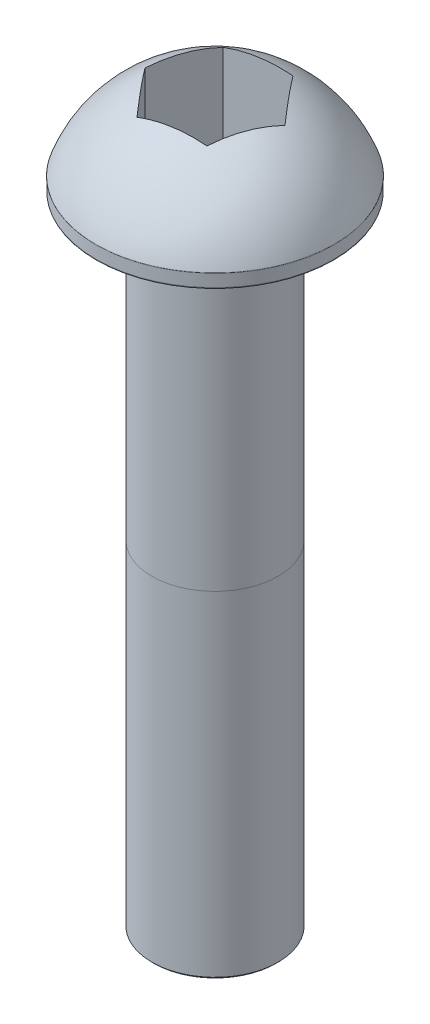
ISO-10303-21;
HEADER;
FILE_DESCRIPTION(('STEP AP214'),'2;1');
FILE_NAME('part.step','',(''),(''),'','','');
FILE_SCHEMA(('AUTOMOTIVE_DESIGN { 1 0 10303 214 1 1 1 1 }'));
ENDSEC;
DATA;
#1=APPLICATION_CONTEXT('core data for automotive mechanical design processes');
#2=APPLICATION_PROTOCOL_DEFINITION('international standard','automotive_design',2000,#1);
#3=PRODUCT_CONTEXT('',#1,'mechanical');
#4=PRODUCT('Part','Part','',(#3));
#5=PRODUCT_RELATED_PRODUCT_CATEGORY('part','',(#4));
#6=PRODUCT_DEFINITION_FORMATION('','',#4);
#7=PRODUCT_DEFINITION_CONTEXT('part definition',#1,'design');
#8=PRODUCT_DEFINITION('design','',#6,#7);
#9=PRODUCT_DEFINITION_SHAPE('','',#8);
#10=(LENGTH_UNIT() NAMED_UNIT(*) SI_UNIT(.MILLI.,.METRE.));
#11=(NAMED_UNIT(*) PLANE_ANGLE_UNIT() SI_UNIT($,.RADIAN.));
#12=(NAMED_UNIT(*) SI_UNIT($,.STERADIAN.) SOLID_ANGLE_UNIT());
#13=UNCERTAINTY_MEASURE_WITH_UNIT(LENGTH_MEASURE(1.E-05),#10,'distance_accuracy_value','');
#14=(GEOMETRIC_REPRESENTATION_CONTEXT(3) GLOBAL_UNCERTAINTY_ASSIGNED_CONTEXT((#13)) GLOBAL_UNIT_ASSIGNED_CONTEXT((#10,
#11,#12)) REPRESENTATION_CONTEXT('',''));
#15=CARTESIAN_POINT('',(0.,0.,0.));
#16=DIRECTION('',(0.,0.,1.));
#17=DIRECTION('',(1.,0.,0.));
#18=AXIS2_PLACEMENT_3D('',#15,#16,#17);
#19=CARTESIAN_POINT('',(0.,22.75,0.));
#20=DIRECTION('',(0.,-1.,0.));
#21=DIRECTION('',(0.,0.,-1.));
#22=AXIS2_PLACEMENT_3D('',#19,#20,#21);
#23=CYLINDRICAL_SURFACE('',#22,2.25);
#24=CARTESIAN_POINT('',(0.,0.0750000000000021,0.));
#25=DIRECTION('',(0.,1.,0.));
#26=DIRECTION('',(0.,0.,1.));
#27=AXIS2_PLACEMENT_3D('',#24,#25,#26);
#28=CIRCLE('',#27,2.25);
#29=CARTESIAN_POINT('',(0.,0.0750000000000021,2.25));
#30=VERTEX_POINT('',#29);
#31=EDGE_CURVE('E151',#30,#30,#28,.T.);
#32=ORIENTED_EDGE('',*,*,#31,.T.);
#33=EDGE_LOOP('',(#32));
#34=FACE_BOUND('',#33,.T.);
#35=CARTESIAN_POINT('',(0.,12.,0.));
#36=DIRECTION('',(0.,1.,0.));
#37=DIRECTION('',(0.,0.,1.));
#38=AXIS2_PLACEMENT_3D('',#35,#36,#37);
#39=CIRCLE('',#38,2.25);
#40=CARTESIAN_POINT('',(0.,12.,2.25));
#41=VERTEX_POINT('',#40);
#42=EDGE_CURVE('E11',#41,#41,#39,.T.);
#43=ORIENTED_EDGE('',*,*,#42,.F.);
#44=EDGE_LOOP('',(#43));
#45=FACE_BOUND('',#44,.T.);
#46=ADVANCED_FACE('F39',(#34,#45),#23,.T.);
#47=CARTESIAN_POINT('',(1.38021317383571,26.251,1.66808620723581));
#48=DIRECTION('',(0.166857261222646,0.,0.985981061875571));
#49=DIRECTION('',(0.985981061875571,0.,-0.166857261222646));
#50=AXIS2_PLACEMENT_3D('',#47,#48,#49);
#51=PLANE('',#50);
#52=DIRECTION('',(-0.985981061875571,0.,0.166857261222646));
#53=VECTOR('',#52,1.);
#54=CARTESIAN_POINT('',(1.38021317383571,17.,1.66808620723581));
#55=LINE('',#54,#53);
#56=CARTESIAN_POINT('',(1.38021317383571,17.,1.66808620723581));
#57=VERTEX_POINT('',#56);
#58=CARTESIAN_POINT('',(-0.75449844425079,17.,2.02934277479758));
#59=VERTEX_POINT('',#58);
#60=EDGE_CURVE('E55',#57,#59,#55,.T.);
#61=ORIENTED_EDGE('',*,*,#60,.T.);
#62=DIRECTION('',(0.,-1.,0.));
#63=VECTOR('',#62,1.);
#64=CARTESIAN_POINT('',(-0.75449844425079,26.251,2.02934277479758));
#65=LINE('',#64,#63);
#66=CARTESIAN_POINT('',(-0.75449844425079,25.6963949926045,2.02934277479758));
#67=VERTEX_POINT('',#66);
#68=EDGE_CURVE('E124',#67,#59,#65,.T.);
#69=ORIENTED_EDGE('',*,*,#68,.F.);
#70=CARTESIAN_POINT('',(0.31285736479246,21.7395833333333,1.84871449101669));
#71=DIRECTION('',(0.166857261222646,0.,0.985981061875571));
#72=DIRECTION('',(0.985981061875571,0.,-0.166857261222646));
#73=AXIS2_PLACEMENT_3D('',#70,#71,#72);
#74=CIRCLE('',#73,4.10222299576028);
#75=CARTESIAN_POINT('',(1.38021317383571,25.6963949926045,1.66808620723581));
#76=VERTEX_POINT('',#75);
#77=EDGE_CURVE('E118',#76,#67,#74,.T.);
#78=ORIENTED_EDGE('',*,*,#77,.F.);
#79=DIRECTION('',(0.,-1.,0.));
#80=VECTOR('',#79,1.);
#81=CARTESIAN_POINT('',(1.38021317383571,26.251,1.66808620723581));
#82=LINE('',#81,#80);
#83=EDGE_CURVE('E126',#76,#57,#82,.T.);
#84=ORIENTED_EDGE('',*,*,#83,.T.);
#85=EDGE_LOOP('',(#61,#69,#78,#84));
#86=FACE_BOUND('',#85,.T.);
#87=ADVANCED_FACE('F194',(#86),#51,.F.);
#88=CARTESIAN_POINT('',(-0.75449844425079,26.251,2.02934277479758));
#89=DIRECTION('',(-0.770456016623278,0.,0.637493157962492));
#90=DIRECTION('',(0.637493157962492,0.,0.770456016623278));
#91=AXIS2_PLACEMENT_3D('',#88,#89,#90);
#92=PLANE('',#91);
#93=DIRECTION('',(-0.637493157962492,0.,-0.770456016623278));
#94=VECTOR('',#93,1.);
#95=CARTESIAN_POINT('',(-0.75449844425079,17.,2.02934277479758));
#96=LINE('',#95,#94);
#97=CARTESIAN_POINT('',(-2.1347116180865,17.,0.361256567561766));
#98=VERTEX_POINT('',#97);
#99=EDGE_CURVE('E62',#59,#98,#96,.T.);
#100=ORIENTED_EDGE('',*,*,#99,.T.);
#101=DIRECTION('',(0.,-1.,0.));
#102=VECTOR('',#101,1.);
#103=CARTESIAN_POINT('',(-2.1347116180865,26.251,0.361256567561766));
#104=LINE('',#103,#102);
#105=CARTESIAN_POINT('',(-2.1347116180865,25.6963949926045,0.361256567561766));
#106=VERTEX_POINT('',#105);
#107=EDGE_CURVE('E135',#106,#98,#104,.T.);
#108=ORIENTED_EDGE('',*,*,#107,.F.);
#109=CARTESIAN_POINT('',(-1.44460503116865,21.7395833333333,1.19529967117967));
#110=DIRECTION('',(-0.770456016623278,0.,0.637493157962492));
#111=DIRECTION('',(0.637493157962492,0.,0.770456016623278));
#112=AXIS2_PLACEMENT_3D('',#109,#110,#111);
#113=CIRCLE('',#112,4.10222299576028);
#114=EDGE_CURVE('E136',#67,#106,#113,.T.);
#115=ORIENTED_EDGE('',*,*,#114,.F.);
#116=ORIENTED_EDGE('',*,*,#68,.T.);
#117=EDGE_LOOP('',(#100,#108,#115,#116));
#118=FACE_BOUND('',#117,.T.);
#119=ADVANCED_FACE('F200',(#118),#92,.F.);
#120=CARTESIAN_POINT('',(-2.1347116180865,26.251,0.361256567561766));
#121=DIRECTION('',(-0.937313277845923,0.,-0.348487903913078));
#122=DIRECTION('',(-0.348487903913078,0.,0.937313277845923));
#123=AXIS2_PLACEMENT_3D('',#120,#121,#122);
#124=PLANE('',#123);
#125=DIRECTION('',(0.348487903913078,0.,-0.937313277845923));
#126=VECTOR('',#125,1.);
#127=CARTESIAN_POINT('',(-2.1347116180865,17.,0.361256567561766));
#128=LINE('',#127,#126);
#129=CARTESIAN_POINT('',(-1.38021317383571,17.,-1.66808620723581));
#130=VERTEX_POINT('',#129);
#131=EDGE_CURVE('E354',#98,#130,#128,.T.);
#132=ORIENTED_EDGE('',*,*,#131,.T.);
#133=DIRECTION('',(0.,-1.,0.));
#134=VECTOR('',#133,1.);
#135=CARTESIAN_POINT('',(-1.38021317383571,26.251,-1.66808620723581));
#136=LINE('',#135,#134);
#137=CARTESIAN_POINT('',(-1.38021317383571,25.6963949926045,-1.66808620723581));
#138=VERTEX_POINT('',#137);
#139=EDGE_CURVE('E131',#138,#130,#136,.T.);
#140=ORIENTED_EDGE('',*,*,#139,.F.);
#141=CARTESIAN_POINT('',(-1.75746239596111,21.7395833333333,-0.653414819837022));
#142=DIRECTION('',(-0.937313277845923,0.,-0.348487903913078));
#143=DIRECTION('',(-0.348487903913078,0.,0.937313277845923));
#144=AXIS2_PLACEMENT_3D('',#141,#142,#143);
#145=CIRCLE('',#144,4.10222299576028);
#146=EDGE_CURVE('E132',#106,#138,#145,.T.);
#147=ORIENTED_EDGE('',*,*,#146,.F.);
#148=ORIENTED_EDGE('',*,*,#107,.T.);
#149=EDGE_LOOP('',(#132,#140,#147,#148));
#150=FACE_BOUND('',#149,.T.);
#151=ADVANCED_FACE('F228',(#150),#124,.F.);
#152=CARTESIAN_POINT('',(-1.38021317383571,26.251,-1.66808620723581));
#153=DIRECTION('',(-0.166857261222645,0.,-0.985981061875571));
#154=DIRECTION('',(-0.985981061875571,0.,0.166857261222645));
#155=AXIS2_PLACEMENT_3D('',#152,#153,#154);
#156=PLANE('',#155);
#157=DIRECTION('',(0.985981061875571,0.,-0.166857261222645));
#158=VECTOR('',#157,1.);
#159=CARTESIAN_POINT('',(-1.38021317383571,17.,-1.66808620723581));
#160=LINE('',#159,#158);
#161=CARTESIAN_POINT('',(0.754498444250791,17.,-2.02934277479758));
#162=VERTEX_POINT('',#161);
#163=EDGE_CURVE('E114',#130,#162,#160,.T.);
#164=ORIENTED_EDGE('',*,*,#163,.T.);
#165=DIRECTION('',(0.,-1.,0.));
#166=VECTOR('',#165,1.);
#167=CARTESIAN_POINT('',(0.754498444250791,26.251,-2.02934277479758));
#168=LINE('',#167,#166);
#169=CARTESIAN_POINT('',(0.754498444250791,25.6963949926045,-2.02934277479758));
#170=VERTEX_POINT('',#169);
#171=EDGE_CURVE('E111',#170,#162,#168,.T.);
#172=ORIENTED_EDGE('',*,*,#171,.F.);
#173=CARTESIAN_POINT('',(-0.31285736479246,21.7395833333333,-1.8487144910167));
#174=DIRECTION('',(-0.166857261222645,0.,-0.985981061875571));
#175=DIRECTION('',(-0.985981061875571,0.,0.166857261222645));
#176=AXIS2_PLACEMENT_3D('',#173,#174,#175);
#177=CIRCLE('',#176,4.10222299576028);
#178=EDGE_CURVE('E128',#138,#170,#177,.T.);
#179=ORIENTED_EDGE('',*,*,#178,.F.);
#180=ORIENTED_EDGE('',*,*,#139,.T.);
#181=EDGE_LOOP('',(#164,#172,#179,#180));
#182=FACE_BOUND('',#181,.T.);
#183=ADVANCED_FACE('F231',(#182),#156,.F.);
#184=CARTESIAN_POINT('',(0.754498444250791,26.251,-2.02934277479758));
#185=DIRECTION('',(0.770456016623278,0.,-0.637493157962492));
#186=DIRECTION('',(-0.637493157962492,0.,-0.770456016623278));
#187=AXIS2_PLACEMENT_3D('',#184,#185,#186);
#188=PLANE('',#187);
#189=DIRECTION('',(0.637493157962492,0.,0.770456016623278));
#190=VECTOR('',#189,1.);
#191=CARTESIAN_POINT('',(0.754498444250791,17.,-2.02934277479758));
#192=LINE('',#191,#190);
#193=CARTESIAN_POINT('',(2.1347116180865,17.,-0.361256567561767));
#194=VERTEX_POINT('',#193);
#195=EDGE_CURVE('E108',#162,#194,#192,.T.);
#196=ORIENTED_EDGE('',*,*,#195,.T.);
#197=DIRECTION('',(0.,-1.,0.));
#198=VECTOR('',#197,1.);
#199=CARTESIAN_POINT('',(2.1347116180865,26.251,-0.361256567561767));
#200=LINE('',#199,#198);
#201=CARTESIAN_POINT('',(2.1347116180865,25.6963949926045,-0.361256567561767));
#202=VERTEX_POINT('',#201);
#203=EDGE_CURVE('E95',#202,#194,#200,.T.);
#204=ORIENTED_EDGE('',*,*,#203,.F.);
#205=CARTESIAN_POINT('',(1.44460503116865,21.7395833333333,-1.19529967117967));
#206=DIRECTION('',(0.770456016623278,0.,-0.637493157962492));
#207=DIRECTION('',(-0.637493157962492,0.,-0.770456016623278));
#208=AXIS2_PLACEMENT_3D('',#205,#206,#207);
#209=CIRCLE('',#208,4.10222299576028);
#210=EDGE_CURVE('E104',#170,#202,#209,.T.);
#211=ORIENTED_EDGE('',*,*,#210,.F.);
#212=ORIENTED_EDGE('',*,*,#171,.T.);
#213=EDGE_LOOP('',(#196,#204,#211,#212));
#214=FACE_BOUND('',#213,.T.);
#215=ADVANCED_FACE('F109',(#214),#188,.F.);
#216=CARTESIAN_POINT('',(2.1347116180865,26.251,-0.361256567561767));
#217=DIRECTION('',(0.937313277845923,0.,0.348487903913078));
#218=DIRECTION('',(0.348487903913078,0.,-0.937313277845923));
#219=AXIS2_PLACEMENT_3D('',#216,#217,#218);
#220=PLANE('',#219);
#221=DIRECTION('',(-0.348487903913078,0.,0.937313277845923));
#222=VECTOR('',#221,1.);
#223=CARTESIAN_POINT('',(2.1347116180865,17.,-0.361256567561767));
#224=LINE('',#223,#222);
#225=EDGE_CURVE('E99',#194,#57,#224,.T.);
#226=ORIENTED_EDGE('',*,*,#225,.T.);
#227=ORIENTED_EDGE('',*,*,#83,.F.);
#228=CARTESIAN_POINT('',(1.75746239596111,21.7395833333333,0.653414819837022));
#229=DIRECTION('',(0.937313277845923,0.,0.348487903913078));
#230=DIRECTION('',(0.348487903913078,0.,-0.937313277845923));
#231=AXIS2_PLACEMENT_3D('',#228,#229,#230);
#232=CIRCLE('',#231,4.10222299576028);
#233=EDGE_CURVE('E101',#202,#76,#232,.T.);
#234=ORIENTED_EDGE('',*,*,#233,.F.);
#235=ORIENTED_EDGE('',*,*,#203,.T.);
#236=EDGE_LOOP('',(#226,#227,#234,#235));
#237=FACE_BOUND('',#236,.T.);
#238=ADVANCED_FACE('F97',(#237),#220,.F.);
#239=ORIENTED_EDGE('',*,*,#42,.T.);
#240=EDGE_LOOP('',(#239));
#241=FACE_BOUND('',#240,.T.);
#242=CARTESIAN_POINT('',(0.,22.25,0.));
#243=DIRECTION('',(0.,1.,0.));
#244=DIRECTION('',(0.,0.,1.));
#245=AXIS2_PLACEMENT_3D('',#242,#243,#244);
#246=CIRCLE('',#245,2.25);
#247=CARTESIAN_POINT('',(0.,22.25,2.25));
#248=VERTEX_POINT('',#247);
#249=EDGE_CURVE('E148',#248,#248,#246,.F.);
#250=ORIENTED_EDGE('',*,*,#249,.T.);
#251=EDGE_LOOP('',(#250));
#252=FACE_BOUND('',#251,.T.);
#253=ADVANCED_FACE('F189',(#241,#252),#23,.T.);
#254=CARTESIAN_POINT('',(0.,0.,0.));
#255=DIRECTION('',(0.,1.,0.));
#256=DIRECTION('',(0.,0.,1.));
#257=AXIS2_PLACEMENT_3D('',#254,#255,#256);
#258=PLANE('',#257);
#259=CARTESIAN_POINT('',(0.,0.,0.));
#260=DIRECTION('',(0.,1.,0.));
#261=DIRECTION('',(0.,0.,1.));
#262=AXIS2_PLACEMENT_3D('',#259,#260,#261);
#263=CIRCLE('',#262,2.175);
#264=CARTESIAN_POINT('',(0.,0.,2.175));
#265=VERTEX_POINT('',#264);
#266=EDGE_CURVE('E154',#265,#265,#263,.F.);
#267=ORIENTED_EDGE('',*,*,#266,.T.);
#268=EDGE_LOOP('',(#267));
#269=FACE_BOUND('',#268,.T.);
#270=ADVANCED_FACE('F179',(#269),#258,.F.);
#271=CARTESIAN_POINT('',(0.,23.25,0.));
#272=DIRECTION('',(0.,-1.,0.));
#273=DIRECTION('',(0.,0.,-1.));
#274=AXIS2_PLACEMENT_3D('',#271,#272,#273);
#275=CYLINDRICAL_SURFACE('',#274,4.25);
#276=CARTESIAN_POINT('',(0.,23.2413545676689,0.));
#277=DIRECTION('',(0.,-0.999999999999999,0.));
#278=DIRECTION('',(0.,0.,-1.));
#279=AXIS2_PLACEMENT_3D('',#276,#277,#278);
#280=CIRCLE('',#279,4.25);
#281=CARTESIAN_POINT('',(0.,23.2413545676689,-4.25));
#282=VERTEX_POINT('',#281);
#283=EDGE_CURVE('E163',#282,#282,#280,.T.);
#284=ORIENTED_EDGE('',*,*,#283,.T.);
#285=EDGE_LOOP('',(#284));
#286=FACE_BOUND('',#285,.T.);
#287=CARTESIAN_POINT('',(0.,22.8,0.));
#288=DIRECTION('',(0.,1.,0.));
#289=DIRECTION('',(0.,0.,1.));
#290=AXIS2_PLACEMENT_3D('',#287,#288,#289);
#291=CIRCLE('',#290,4.25);
#292=CARTESIAN_POINT('',(0.,22.8,4.25));
#293=VERTEX_POINT('',#292);
#294=EDGE_CURVE('E160',#293,#293,#291,.T.);
#295=ORIENTED_EDGE('',*,*,#294,.T.);
#296=EDGE_LOOP('',(#295));
#297=FACE_BOUND('',#296,.T.);
#298=ADVANCED_FACE('F176',(#286,#297),#275,.T.);
#299=CARTESIAN_POINT('',(0.,21.7395833333333,0.));
#300=DIRECTION('',(0.,0.,1.));
#301=DIRECTION('',(1.,0.,0.));
#302=AXIS2_PLACEMENT_3D('',#299,#300,#301);
#303=SPHERICAL_SURFACE('',#302,4.51041666666667);
#304=CARTESIAN_POINT('',(0.,23.2581889953308,0.));
#305=DIRECTION('',(0.,-0.999999999999999,0.));
#306=DIRECTION('',(0.,0.,-1.));
#307=AXIS2_PLACEMENT_3D('',#304,#305,#306);
#308=CIRCLE('',#307,4.24708080336291);
#309=CARTESIAN_POINT('',(0.,23.2581889953308,-4.24708080336291));
#310=VERTEX_POINT('',#309);
#311=EDGE_CURVE('E157',#310,#310,#308,.F.);
#312=ORIENTED_EDGE('',*,*,#311,.T.);
#313=EDGE_LOOP('',(#312));
#314=FACE_BOUND('',#313,.T.);
#315=ORIENTED_EDGE('',*,*,#77,.T.);
#316=ORIENTED_EDGE('',*,*,#114,.T.);
#317=ORIENTED_EDGE('',*,*,#146,.T.);
#318=ORIENTED_EDGE('',*,*,#178,.T.);
#319=ORIENTED_EDGE('',*,*,#210,.T.);
#320=ORIENTED_EDGE('',*,*,#233,.T.);
#321=EDGE_LOOP('',(#315,#316,#317,#318,#319,#320));
#322=FACE_BOUND('',#321,.T.);
#323=ADVANCED_FACE('F178',(#314,#322),#303,.T.);
#324=CARTESIAN_POINT('',(0.,22.75,0.));
#325=DIRECTION('',(0.,1.,0.));
#326=DIRECTION('',(0.,0.,1.));
#327=AXIS2_PLACEMENT_3D('',#324,#325,#326);
#328=PLANE('',#327);
#329=CARTESIAN_POINT('',(0.,22.75,0.));
#330=DIRECTION('',(0.,1.,0.));
#331=DIRECTION('',(0.,0.,1.));
#332=AXIS2_PLACEMENT_3D('',#329,#330,#331);
#333=CIRCLE('',#332,4.2);
#334=CARTESIAN_POINT('',(0.,22.75,4.2));
#335=VERTEX_POINT('',#334);
#336=EDGE_CURVE('E48',#335,#335,#333,.F.);
#337=ORIENTED_EDGE('',*,*,#336,.T.);
#338=EDGE_LOOP('',(#337));
#339=FACE_BOUND('',#338,.T.);
#340=CARTESIAN_POINT('',(0.,22.75,0.));
#341=DIRECTION('',(0.,1.,0.));
#342=DIRECTION('',(0.,0.,1.));
#343=AXIS2_PLACEMENT_3D('',#340,#341,#342);
#344=CIRCLE('',#343,2.75);
#345=CARTESIAN_POINT('',(0.,22.75,2.75));
#346=VERTEX_POINT('',#345);
#347=EDGE_CURVE('E145',#346,#346,#344,.T.);
#348=ORIENTED_EDGE('',*,*,#347,.T.);
#349=EDGE_LOOP('',(#348));
#350=FACE_BOUND('',#349,.T.);
#351=ADVANCED_FACE('F168',(#339,#350),#328,.F.);
#352=CARTESIAN_POINT('',(0.,17.,0.));
#353=DIRECTION('',(0.,-1.,0.));
#354=DIRECTION('',(0.,0.,-1.));
#355=AXIS2_PLACEMENT_3D('',#352,#353,#354);
#356=PLANE('',#355);
#357=ORIENTED_EDGE('',*,*,#99,.F.);
#358=ORIENTED_EDGE('',*,*,#60,.F.);
#359=ORIENTED_EDGE('',*,*,#225,.F.);
#360=ORIENTED_EDGE('',*,*,#195,.F.);
#361=ORIENTED_EDGE('',*,*,#163,.F.);
#362=ORIENTED_EDGE('',*,*,#131,.F.);
#363=EDGE_LOOP('',(#357,#358,#359,#360,#361,#362));
#364=FACE_BOUND('',#363,.T.);
#365=ADVANCED_FACE('F116',(#364),#356,.F.);
#366=CARTESIAN_POINT('',(0.,22.25,0.));
#367=DIRECTION('',(0.,1.,0.));
#368=DIRECTION('',(0.,0.,1.));
#369=AXIS2_PLACEMENT_3D('',#366,#367,#368);
#370=TOROIDAL_SURFACE('',#369,2.75,0.5);
#371=ORIENTED_EDGE('',*,*,#249,.F.);
#372=EDGE_LOOP('',(#371));
#373=FACE_BOUND('',#372,.T.);
#374=ORIENTED_EDGE('',*,*,#347,.F.);
#375=EDGE_LOOP('',(#374));
#376=FACE_BOUND('',#375,.T.);
#377=ADVANCED_FACE('F213',(#373,#376),#370,.F.);
#378=CARTESIAN_POINT('',(0.,0.0750000000000021,0.));
#379=DIRECTION('',(0.,1.,0.));
#380=DIRECTION('',(0.,0.,1.));
#381=AXIS2_PLACEMENT_3D('',#378,#379,#380);
#382=CONICAL_SURFACE('',#381,2.25,0.785398163397457);
#383=ORIENTED_EDGE('',*,*,#266,.F.);
#384=EDGE_LOOP('',(#383));
#385=FACE_BOUND('',#384,.T.);
#386=ORIENTED_EDGE('',*,*,#31,.F.);
#387=EDGE_LOOP('',(#386));
#388=FACE_BOUND('',#387,.T.);
#389=ADVANCED_FACE('F216',(#385,#388),#382,.T.);
#390=CARTESIAN_POINT('',(0.,23.2413545676689,0.));
#391=DIRECTION('',(0.,-0.999999999999999,0.));
#392=DIRECTION('',(0.,0.,-1.));
#393=AXIS2_PLACEMENT_3D('',#390,#391,#392);
#394=TOROIDAL_SURFACE('',#393,4.2,0.05);
#395=ORIENTED_EDGE('',*,*,#283,.F.);
#396=EDGE_LOOP('',(#395));
#397=FACE_BOUND('',#396,.T.);
#398=ORIENTED_EDGE('',*,*,#311,.F.);
#399=EDGE_LOOP('',(#398));
#400=FACE_BOUND('',#399,.T.);
#401=ADVANCED_FACE('F173',(#397,#400),#394,.T.);
#402=CARTESIAN_POINT('',(0.,22.8,0.));
#403=DIRECTION('',(0.,1.,0.));
#404=DIRECTION('',(0.,0.,1.));
#405=AXIS2_PLACEMENT_3D('',#402,#403,#404);
#406=TOROIDAL_SURFACE('',#405,4.2,0.05);
#407=ORIENTED_EDGE('',*,*,#336,.F.);
#408=EDGE_LOOP('',(#407));
#409=FACE_BOUND('',#408,.T.);
#410=ORIENTED_EDGE('',*,*,#294,.F.);
#411=EDGE_LOOP('',(#410));
#412=FACE_BOUND('',#411,.T.);
#413=ADVANCED_FACE('F41',(#409,#412),#406,.T.);
#414=CLOSED_SHELL('',(#46,#87,#119,#151,#183,#215,#238,#253,#270,#298,#323,#351,#365,#377,#389,
#401,#413));
#415=MANIFOLD_SOLID_BREP('B2',#414);
#416=ADVANCED_BREP_SHAPE_REPRESENTATION('',(#18,#415),#14);
#417=SHAPE_DEFINITION_REPRESENTATION(#9,#416);
ENDSEC;
END-ISO-10303-21;
